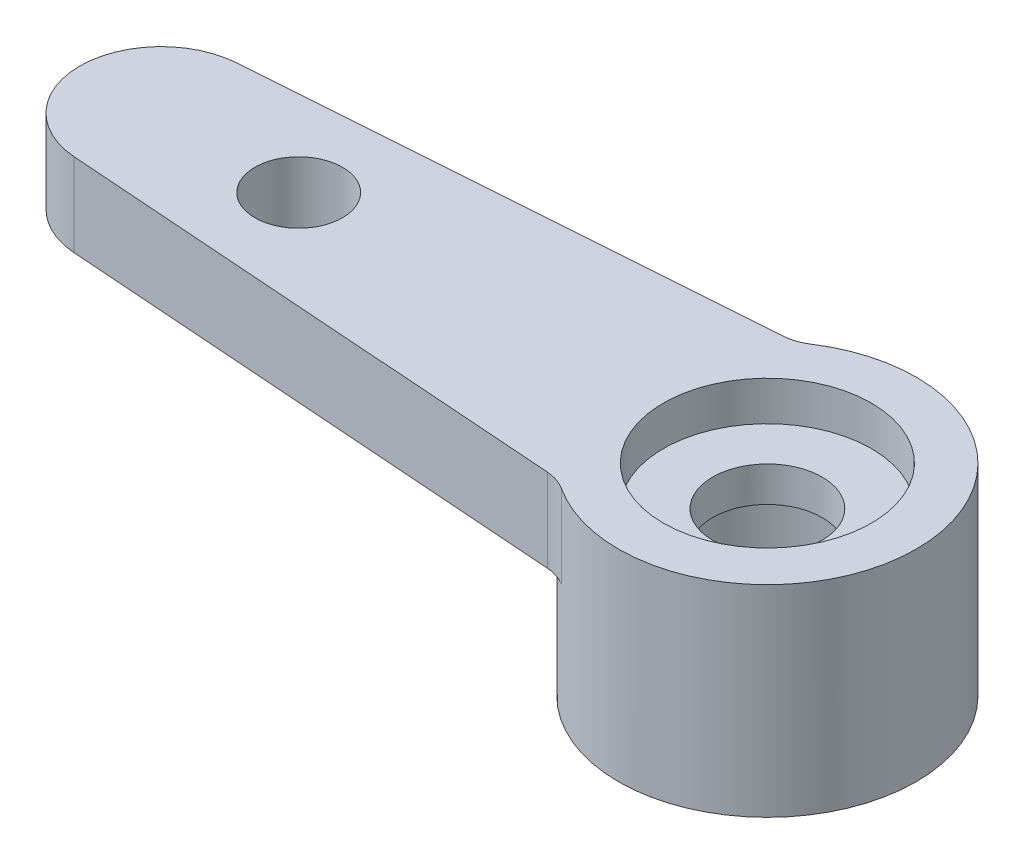
ISO-10303-21;
HEADER;
FILE_DESCRIPTION(('STEP AP214'),'2;1');
FILE_NAME('part.step','',(''),(''),'','','');
FILE_SCHEMA(('AUTOMOTIVE_DESIGN { 1 0 10303 214 1 1 1 1 }'));
ENDSEC;
DATA;
#1=APPLICATION_CONTEXT('core data for automotive mechanical design processes');
#2=APPLICATION_PROTOCOL_DEFINITION('international standard','automotive_design',2000,#1);
#3=PRODUCT_CONTEXT('',#1,'mechanical');
#4=PRODUCT('Part','Part','',(#3));
#5=PRODUCT_RELATED_PRODUCT_CATEGORY('part','',(#4));
#6=PRODUCT_DEFINITION_FORMATION('','',#4);
#7=PRODUCT_DEFINITION_CONTEXT('part definition',#1,'design');
#8=PRODUCT_DEFINITION('design','',#6,#7);
#9=PRODUCT_DEFINITION_SHAPE('','',#8);
#10=(LENGTH_UNIT() NAMED_UNIT(*) SI_UNIT(.MILLI.,.METRE.));
#11=(NAMED_UNIT(*) PLANE_ANGLE_UNIT() SI_UNIT($,.RADIAN.));
#12=(NAMED_UNIT(*) SI_UNIT($,.STERADIAN.) SOLID_ANGLE_UNIT());
#13=UNCERTAINTY_MEASURE_WITH_UNIT(LENGTH_MEASURE(1.E-05),#10,'distance_accuracy_value','');
#14=(GEOMETRIC_REPRESENTATION_CONTEXT(3) GLOBAL_UNCERTAINTY_ASSIGNED_CONTEXT((#13)) GLOBAL_UNIT_ASSIGNED_CONTEXT((#10,
#11,#12)) REPRESENTATION_CONTEXT('',''));
#15=CARTESIAN_POINT('',(0.,0.,0.));
#16=DIRECTION('',(0.,0.,1.));
#17=DIRECTION('',(1.,0.,0.));
#18=AXIS2_PLACEMENT_3D('',#15,#16,#17);
#19=CARTESIAN_POINT('',(0.,-0.00100000000000013,0.));
#20=DIRECTION('',(0.,1.,0.));
#21=DIRECTION('',(0.,0.,1.));
#22=AXIS2_PLACEMENT_3D('',#19,#20,#21);
#23=CYLINDRICAL_SURFACE('',#22,1.25);
#24=CARTESIAN_POINT('',(0.,2.9,0.));
#25=DIRECTION('',(0.,-1.,0.));
#26=DIRECTION('',(0.,0.,-1.));
#27=AXIS2_PLACEMENT_3D('',#24,#25,#26);
#28=CIRCLE('',#27,1.25);
#29=CARTESIAN_POINT('',(0.,2.9,-1.25));
#30=VERTEX_POINT('',#29);
#31=EDGE_CURVE('E203',#30,#30,#28,.F.);
#32=ORIENTED_EDGE('',*,*,#31,.F.);
#33=EDGE_LOOP('',(#32));
#34=FACE_BOUND('',#33,.T.);
#35=CARTESIAN_POINT('',(0.,3.7,0.));
#36=DIRECTION('',(0.,1.,0.));
#37=DIRECTION('',(0.,0.,1.));
#38=AXIS2_PLACEMENT_3D('',#35,#36,#37);
#39=CIRCLE('',#38,1.25);
#40=CARTESIAN_POINT('',(0.,3.7,1.25));
#41=VERTEX_POINT('',#40);
#42=EDGE_CURVE('E38',#41,#41,#39,.F.);
#43=ORIENTED_EDGE('',*,*,#42,.F.);
#44=EDGE_LOOP('',(#43));
#45=FACE_BOUND('',#44,.T.);
#46=ADVANCED_FACE('F34',(#34,#45),#23,.F.);
#47=CARTESIAN_POINT('',(0.,4.6,0.));
#48=DIRECTION('',(0.,-1.,0.));
#49=DIRECTION('',(0.,0.,-1.));
#50=AXIS2_PLACEMENT_3D('',#47,#48,#49);
#51=CYLINDRICAL_SURFACE('',#50,3.4);
#52=CARTESIAN_POINT('',(0.,2.7,0.));
#53=DIRECTION('',(0.,1.,0.));
#54=DIRECTION('',(0.,0.,1.));
#55=AXIS2_PLACEMENT_3D('',#52,#53,#54);
#56=CIRCLE('',#55,3.4);
#57=CARTESIAN_POINT('',(-1.85469778922049,2.7,-2.84957823381998));
#58=VERTEX_POINT('',#57);
#59=CARTESIAN_POINT('',(-1.85469778922049,2.7,2.84957823381999));
#60=VERTEX_POINT('',#59);
#61=EDGE_CURVE('E123',#58,#60,#56,.T.);
#62=ORIENTED_EDGE('',*,*,#61,.F.);
#63=DIRECTION('',(0.,-1.,0.));
#64=VECTOR('',#63,1.);
#65=CARTESIAN_POINT('',(-1.85469778922049,4.6,-2.84957823381999));
#66=LINE('',#65,#64);
#67=CARTESIAN_POINT('',(-1.85469778922049,4.6,-2.84957823381998));
#68=VERTEX_POINT('',#67);
#69=EDGE_CURVE('E130',#58,#68,#66,.F.);
#70=ORIENTED_EDGE('',*,*,#69,.T.);
#71=CARTESIAN_POINT('',(0.,4.6,0.));
#72=DIRECTION('',(0.,1.,0.));
#73=DIRECTION('',(0.,0.,1.));
#74=AXIS2_PLACEMENT_3D('',#71,#72,#73);
#75=CIRCLE('',#74,3.4);
#76=CARTESIAN_POINT('',(-1.85469778922049,4.6,2.84957823381999));
#77=VERTEX_POINT('',#76);
#78=EDGE_CURVE('E120',#77,#68,#75,.T.);
#79=ORIENTED_EDGE('',*,*,#78,.F.);
#80=DIRECTION('',(0.,-1.,0.));
#81=VECTOR('',#80,1.);
#82=CARTESIAN_POINT('',(-1.85469778922049,4.6,2.84957823381999));
#83=LINE('',#82,#81);
#84=EDGE_CURVE('E127',#77,#60,#83,.T.);
#85=ORIENTED_EDGE('',*,*,#84,.T.);
#86=EDGE_LOOP('',(#62,#70,#79,#85));
#87=FACE_BOUND('',#86,.T.);
#88=CARTESIAN_POINT('',(0.,0.,0.));
#89=DIRECTION('',(0.,1.,0.));
#90=DIRECTION('',(0.,0.,1.));
#91=AXIS2_PLACEMENT_3D('',#88,#89,#90);
#92=CIRCLE('',#91,3.4);
#93=CARTESIAN_POINT('',(0.,0.,3.4));
#94=VERTEX_POINT('',#93);
#95=EDGE_CURVE('E118',#94,#94,#92,.T.);
#96=ORIENTED_EDGE('',*,*,#95,.T.);
#97=EDGE_LOOP('',(#96));
#98=FACE_BOUND('',#97,.T.);
#99=ADVANCED_FACE('F146',(#87,#98),#51,.T.);
#100=CARTESIAN_POINT('',(0.,4.6,0.));
#101=DIRECTION('',(0.,1.,0.));
#102=DIRECTION('',(0.,0.,1.));
#103=AXIS2_PLACEMENT_3D('',#100,#101,#102);
#104=PLANE('',#103);
#105=CARTESIAN_POINT('',(-10.7,4.6,0.));
#106=DIRECTION('',(0.,1.,0.));
#107=DIRECTION('',(0.,0.,1.));
#108=AXIS2_PLACEMENT_3D('',#105,#106,#107);
#109=CIRCLE('',#108,1.);
#110=CARTESIAN_POINT('',(-10.7,4.6,1.));
#111=VERTEX_POINT('',#110);
#112=EDGE_CURVE('E218',#111,#111,#109,.T.);
#113=ORIENTED_EDGE('',*,*,#112,.F.);
#114=EDGE_LOOP('',(#113));
#115=FACE_BOUND('',#114,.T.);
#116=CARTESIAN_POINT('',(0.,4.6,0.));
#117=DIRECTION('',(0.,1.,0.));
#118=DIRECTION('',(0.,0.,1.));
#119=AXIS2_PLACEMENT_3D('',#116,#117,#118);
#120=CIRCLE('',#119,2.375);
#121=CARTESIAN_POINT('',(0.,4.6,2.375));
#122=VERTEX_POINT('',#121);
#123=EDGE_CURVE('E210',#122,#122,#120,.T.);
#124=ORIENTED_EDGE('',*,*,#123,.F.);
#125=EDGE_LOOP('',(#124));
#126=FACE_BOUND('',#125,.T.);
#127=DIRECTION('',(0.997438729547009,0.,0.0715260847498971));
#128=VECTOR('',#127,1.);
#129=CARTESIAN_POINT('',(-13.9730385176348,4.6,1.85523603695744));
#130=LINE('',#129,#128);
#131=CARTESIAN_POINT('',(-13.9730385176348,4.6,1.85523603695744));
#132=VERTEX_POINT('',#131);
#133=CARTESIAN_POINT('',(-2.32867105424132,4.6,2.69025074951415));
#134=VERTEX_POINT('',#133);
#135=EDGE_CURVE('E90',#132,#134,#130,.T.);
#136=ORIENTED_EDGE('',*,*,#135,.T.);
#137=CARTESIAN_POINT('',(-2.40019713899122,4.6,3.68768947906116));
#138=DIRECTION('',(0.,1.,0.));
#139=DIRECTION('',(0.,0.,1.));
#140=AXIS2_PLACEMENT_3D('',#137,#138,#139);
#141=CIRCLE('',#140,1.);
#142=EDGE_CURVE('E43',#134,#77,#141,.F.);
#143=ORIENTED_EDGE('',*,*,#142,.T.);
#144=ORIENTED_EDGE('',*,*,#78,.T.);
#145=CARTESIAN_POINT('',(-2.40019713899122,4.6,-3.68768947906116));
#146=DIRECTION('',(0.,1.,0.));
#147=DIRECTION('',(0.,0.,1.));
#148=AXIS2_PLACEMENT_3D('',#145,#146,#147);
#149=CIRCLE('',#148,1.);
#150=CARTESIAN_POINT('',(-2.32867105424132,4.6,-2.69025074951415));
#151=VERTEX_POINT('',#150);
#152=EDGE_CURVE('E137',#68,#151,#149,.F.);
#153=ORIENTED_EDGE('',*,*,#152,.T.);
#154=DIRECTION('',(-0.997438729547009,0.,0.0715260847498974));
#155=VECTOR('',#154,1.);
#156=CARTESIAN_POINT('',(-13.9730385176348,4.6,-1.85523603695743));
#157=LINE('',#156,#155);
#158=CARTESIAN_POINT('',(-13.9730385176348,4.6,-1.85523603695743));
#159=VERTEX_POINT('',#158);
#160=EDGE_CURVE('E106',#151,#159,#157,.T.);
#161=ORIENTED_EDGE('',*,*,#160,.T.);
#162=CARTESIAN_POINT('',(-13.84,4.6,0.));
#163=DIRECTION('',(0.,1.,0.));
#164=DIRECTION('',(0.,0.,1.));
#165=AXIS2_PLACEMENT_3D('',#162,#163,#164);
#166=CIRCLE('',#165,1.86);
#167=EDGE_CURVE('E114',#159,#132,#166,.T.);
#168=ORIENTED_EDGE('',*,*,#167,.T.);
#169=EDGE_LOOP('',(#136,#143,#144,#153,#161,#168));
#170=FACE_BOUND('',#169,.T.);
#171=ADVANCED_FACE('F144',(#115,#126,#170),#104,.T.);
#172=CARTESIAN_POINT('',(0.,0.,0.));
#173=DIRECTION('',(0.,1.,0.));
#174=DIRECTION('',(0.,0.,1.));
#175=AXIS2_PLACEMENT_3D('',#172,#173,#174);
#176=PLANE('',#175);
#177=CARTESIAN_POINT('',(0.,0.,0.));
#178=DIRECTION('',(0.,-1.,0.));
#179=DIRECTION('',(0.,0.,-1.));
#180=AXIS2_PLACEMENT_3D('',#177,#178,#179);
#181=CIRCLE('',#180,2.325);
#182=CARTESIAN_POINT('',(0.,0.,-2.325));
#183=VERTEX_POINT('',#182);
#184=EDGE_CURVE('E110',#183,#183,#181,.T.);
#185=ORIENTED_EDGE('',*,*,#184,.F.);
#186=EDGE_LOOP('',(#185));
#187=FACE_BOUND('',#186,.T.);
#188=ORIENTED_EDGE('',*,*,#95,.F.);
#189=EDGE_LOOP('',(#188));
#190=FACE_BOUND('',#189,.T.);
#191=ADVANCED_FACE('F181',(#187,#190),#176,.F.);
#192=CARTESIAN_POINT('',(-13.84,2.7,0.));
#193=DIRECTION('',(0.,1.,0.));
#194=DIRECTION('',(0.,0.,1.));
#195=AXIS2_PLACEMENT_3D('',#192,#193,#194);
#196=PLANE('',#195);
#197=CARTESIAN_POINT('',(-10.7,2.7,0.));
#198=DIRECTION('',(0.,1.,0.));
#199=DIRECTION('',(0.,0.,1.));
#200=AXIS2_PLACEMENT_3D('',#197,#198,#199);
#201=CIRCLE('',#200,1.);
#202=CARTESIAN_POINT('',(-10.7,2.7,1.));
#203=VERTEX_POINT('',#202);
#204=EDGE_CURVE('E213',#203,#203,#201,.F.);
#205=ORIENTED_EDGE('',*,*,#204,.F.);
#206=EDGE_LOOP('',(#205));
#207=FACE_BOUND('',#206,.T.);
#208=DIRECTION('',(-0.997438729547009,0.,0.0715260847498974));
#209=VECTOR('',#208,1.);
#210=CARTESIAN_POINT('',(-13.9730385176348,2.7,-1.85523603695743));
#211=LINE('',#210,#209);
#212=CARTESIAN_POINT('',(-2.32867105424132,2.7,-2.69025074951415));
#213=VERTEX_POINT('',#212);
#214=CARTESIAN_POINT('',(-13.9730385176348,2.7,-1.85523603695743));
#215=VERTEX_POINT('',#214);
#216=EDGE_CURVE('E96',#213,#215,#211,.T.);
#217=ORIENTED_EDGE('',*,*,#216,.F.);
#218=CARTESIAN_POINT('',(-2.40019713899122,2.7,-3.68768947906116));
#219=DIRECTION('',(0.,1.,0.));
#220=DIRECTION('',(0.,0.,1.));
#221=AXIS2_PLACEMENT_3D('',#218,#219,#220);
#222=CIRCLE('',#221,1.);
#223=EDGE_CURVE('E139',#213,#58,#222,.T.);
#224=ORIENTED_EDGE('',*,*,#223,.T.);
#225=ORIENTED_EDGE('',*,*,#61,.T.);
#226=CARTESIAN_POINT('',(-2.40019713899122,2.7,3.68768947906116));
#227=DIRECTION('',(0.,1.,0.));
#228=DIRECTION('',(0.,0.,1.));
#229=AXIS2_PLACEMENT_3D('',#226,#227,#228);
#230=CIRCLE('',#229,1.);
#231=CARTESIAN_POINT('',(-2.32867105424132,2.7,2.69025074951415));
#232=VERTEX_POINT('',#231);
#233=EDGE_CURVE('E11',#60,#232,#230,.T.);
#234=ORIENTED_EDGE('',*,*,#233,.T.);
#235=DIRECTION('',(0.997438729547009,0.,0.0715260847498971));
#236=VECTOR('',#235,1.);
#237=CARTESIAN_POINT('',(-13.9730385176348,2.7,1.85523603695744));
#238=LINE('',#237,#236);
#239=CARTESIAN_POINT('',(-13.9730385176348,2.7,1.85523603695744));
#240=VERTEX_POINT('',#239);
#241=EDGE_CURVE('E88',#240,#232,#238,.T.);
#242=ORIENTED_EDGE('',*,*,#241,.F.);
#243=CARTESIAN_POINT('',(-13.84,2.7,0.));
#244=DIRECTION('',(0.,1.,0.));
#245=DIRECTION('',(0.,0.,1.));
#246=AXIS2_PLACEMENT_3D('',#243,#244,#245);
#247=CIRCLE('',#246,1.86);
#248=EDGE_CURVE('E101',#215,#240,#247,.T.);
#249=ORIENTED_EDGE('',*,*,#248,.F.);
#250=EDGE_LOOP('',(#217,#224,#225,#234,#242,#249));
#251=FACE_BOUND('',#250,.T.);
#252=ADVANCED_FACE('F100',(#207,#251),#196,.F.);
#253=CARTESIAN_POINT('',(-13.84,2.7,0.));
#254=DIRECTION('',(0.,1.,0.));
#255=DIRECTION('',(0.,0.,1.));
#256=AXIS2_PLACEMENT_3D('',#253,#254,#255);
#257=CYLINDRICAL_SURFACE('',#256,1.86);
#258=ORIENTED_EDGE('',*,*,#167,.F.);
#259=DIRECTION('',(0.,1.,0.));
#260=VECTOR('',#259,1.);
#261=CARTESIAN_POINT('',(-13.9730385176348,2.7,-1.85523603695743));
#262=LINE('',#261,#260);
#263=EDGE_CURVE('E95',#215,#159,#262,.T.);
#264=ORIENTED_EDGE('',*,*,#263,.F.);
#265=ORIENTED_EDGE('',*,*,#248,.T.);
#266=DIRECTION('',(0.,1.,0.));
#267=VECTOR('',#266,1.);
#268=CARTESIAN_POINT('',(-13.9730385176348,2.7,1.85523603695744));
#269=LINE('',#268,#267);
#270=EDGE_CURVE('E86',#240,#132,#269,.T.);
#271=ORIENTED_EDGE('',*,*,#270,.T.);
#272=EDGE_LOOP('',(#258,#264,#265,#271));
#273=FACE_BOUND('',#272,.T.);
#274=ADVANCED_FACE('F104',(#273),#257,.T.);
#275=CARTESIAN_POINT('',(-13.9730385176348,2.7,-1.85523603695743));
#276=DIRECTION('',(-0.0715260847498974,0.,-0.997438729547009));
#277=DIRECTION('',(-0.997438729547009,0.,0.0715260847498974));
#278=AXIS2_PLACEMENT_3D('',#275,#276,#277);
#279=PLANE('',#278);
#280=ORIENTED_EDGE('',*,*,#160,.F.);
#281=DIRECTION('',(0.,-1.,0.));
#282=VECTOR('',#281,1.);
#283=CARTESIAN_POINT('',(-2.32867105424133,2.7,-2.69025074951415));
#284=LINE('',#283,#282);
#285=EDGE_CURVE('E133',#151,#213,#284,.T.);
#286=ORIENTED_EDGE('',*,*,#285,.T.);
#287=ORIENTED_EDGE('',*,*,#216,.T.);
#288=ORIENTED_EDGE('',*,*,#263,.T.);
#289=EDGE_LOOP('',(#280,#286,#287,#288));
#290=FACE_BOUND('',#289,.T.);
#291=ADVANCED_FACE('F183',(#290),#279,.T.);
#292=CARTESIAN_POINT('',(-13.9730385176348,2.7,1.85523603695744));
#293=DIRECTION('',(-0.0715260847498971,0.,0.997438729547009));
#294=DIRECTION('',(0.997438729547009,0.,0.0715260847498971));
#295=AXIS2_PLACEMENT_3D('',#292,#293,#294);
#296=PLANE('',#295);
#297=ORIENTED_EDGE('',*,*,#241,.T.);
#298=DIRECTION('',(0.,-1.,0.));
#299=VECTOR('',#298,1.);
#300=CARTESIAN_POINT('',(-2.32867105424132,2.7,2.69025074951415));
#301=LINE('',#300,#299);
#302=EDGE_CURVE('E135',#232,#134,#301,.F.);
#303=ORIENTED_EDGE('',*,*,#302,.T.);
#304=ORIENTED_EDGE('',*,*,#135,.F.);
#305=ORIENTED_EDGE('',*,*,#270,.F.);
#306=EDGE_LOOP('',(#297,#303,#304,#305));
#307=FACE_BOUND('',#306,.T.);
#308=ADVANCED_FACE('F87',(#307),#296,.T.);
#309=CARTESIAN_POINT('',(0.,2.9,0.));
#310=DIRECTION('',(0.,-1.,0.));
#311=DIRECTION('',(0.,0.,-1.));
#312=AXIS2_PLACEMENT_3D('',#309,#310,#311);
#313=CYLINDRICAL_SURFACE('',#312,2.325);
#314=CARTESIAN_POINT('',(0.,2.9,0.));
#315=DIRECTION('',(0.,-1.,0.));
#316=DIRECTION('',(0.,0.,-1.));
#317=AXIS2_PLACEMENT_3D('',#314,#315,#316);
#318=CIRCLE('',#317,2.325);
#319=CARTESIAN_POINT('',(0.,2.9,-2.325));
#320=VERTEX_POINT('',#319);
#321=EDGE_CURVE('E116',#320,#320,#318,.T.);
#322=ORIENTED_EDGE('',*,*,#321,.F.);
#323=EDGE_LOOP('',(#322));
#324=FACE_BOUND('',#323,.T.);
#325=ORIENTED_EDGE('',*,*,#184,.T.);
#326=EDGE_LOOP('',(#325));
#327=FACE_BOUND('',#326,.T.);
#328=ADVANCED_FACE('F174',(#324,#327),#313,.F.);
#329=CARTESIAN_POINT('',(0.,2.9,0.));
#330=DIRECTION('',(0.,-1.,0.));
#331=DIRECTION('',(0.,0.,-1.));
#332=AXIS2_PLACEMENT_3D('',#329,#330,#331);
#333=PLANE('',#332);
#334=ORIENTED_EDGE('',*,*,#31,.T.);
#335=EDGE_LOOP('',(#334));
#336=FACE_BOUND('',#335,.T.);
#337=ORIENTED_EDGE('',*,*,#321,.T.);
#338=EDGE_LOOP('',(#337));
#339=FACE_BOUND('',#338,.T.);
#340=ADVANCED_FACE('F159',(#336,#339),#333,.T.);
#341=CARTESIAN_POINT('',(-2.40019713899122,4.6,-3.68768947906116));
#342=DIRECTION('',(0.,-1.,0.));
#343=DIRECTION('',(0.,0.,-1.));
#344=AXIS2_PLACEMENT_3D('',#341,#342,#343);
#345=CYLINDRICAL_SURFACE('',#344,1.);
#346=ORIENTED_EDGE('',*,*,#223,.F.);
#347=ORIENTED_EDGE('',*,*,#285,.F.);
#348=ORIENTED_EDGE('',*,*,#152,.F.);
#349=ORIENTED_EDGE('',*,*,#69,.F.);
#350=EDGE_LOOP('',(#346,#347,#348,#349));
#351=FACE_BOUND('',#350,.T.);
#352=ADVANCED_FACE('F151',(#351),#345,.F.);
#353=CARTESIAN_POINT('',(-2.40019713899122,4.6,3.68768947906116));
#354=DIRECTION('',(0.,-1.,0.));
#355=DIRECTION('',(0.,0.,-1.));
#356=AXIS2_PLACEMENT_3D('',#353,#354,#355);
#357=CYLINDRICAL_SURFACE('',#356,1.);
#358=ORIENTED_EDGE('',*,*,#233,.F.);
#359=ORIENTED_EDGE('',*,*,#84,.F.);
#360=ORIENTED_EDGE('',*,*,#142,.F.);
#361=ORIENTED_EDGE('',*,*,#302,.F.);
#362=EDGE_LOOP('',(#358,#359,#360,#361));
#363=FACE_BOUND('',#362,.T.);
#364=ADVANCED_FACE('F36',(#363),#357,.F.);
#365=CARTESIAN_POINT('',(0.,3.7,0.));
#366=DIRECTION('',(0.,1.,0.));
#367=DIRECTION('',(0.,0.,1.));
#368=AXIS2_PLACEMENT_3D('',#365,#366,#367);
#369=PLANE('',#368);
#370=CARTESIAN_POINT('',(0.,3.7,0.));
#371=DIRECTION('',(0.,1.,0.));
#372=DIRECTION('',(0.,0.,1.));
#373=AXIS2_PLACEMENT_3D('',#370,#371,#372);
#374=CIRCLE('',#373,2.375);
#375=CARTESIAN_POINT('',(0.,3.7,2.375));
#376=VERTEX_POINT('',#375);
#377=EDGE_CURVE('E208',#376,#376,#374,.T.);
#378=ORIENTED_EDGE('',*,*,#377,.T.);
#379=EDGE_LOOP('',(#378));
#380=FACE_BOUND('',#379,.T.);
#381=ORIENTED_EDGE('',*,*,#42,.T.);
#382=EDGE_LOOP('',(#381));
#383=FACE_BOUND('',#382,.T.);
#384=ADVANCED_FACE('F150',(#380,#383),#369,.T.);
#385=CARTESIAN_POINT('',(0.,3.7,0.));
#386=DIRECTION('',(0.,1.,0.));
#387=DIRECTION('',(0.,0.,1.));
#388=AXIS2_PLACEMENT_3D('',#385,#386,#387);
#389=CYLINDRICAL_SURFACE('',#388,2.375);
#390=ORIENTED_EDGE('',*,*,#377,.F.);
#391=EDGE_LOOP('',(#390));
#392=FACE_BOUND('',#391,.T.);
#393=ORIENTED_EDGE('',*,*,#123,.T.);
#394=EDGE_LOOP('',(#393));
#395=FACE_BOUND('',#394,.T.);
#396=ADVANCED_FACE('F156',(#392,#395),#389,.F.);
#397=CARTESIAN_POINT('',(-10.7,-0.00100000000000013,0.));
#398=DIRECTION('',(0.,1.,0.));
#399=DIRECTION('',(0.,0.,1.));
#400=AXIS2_PLACEMENT_3D('',#397,#398,#399);
#401=CYLINDRICAL_SURFACE('',#400,1.);
#402=ORIENTED_EDGE('',*,*,#112,.T.);
#403=EDGE_LOOP('',(#402));
#404=FACE_BOUND('',#403,.T.);
#405=ORIENTED_EDGE('',*,*,#204,.T.);
#406=EDGE_LOOP('',(#405));
#407=FACE_BOUND('',#406,.T.);
#408=ADVANCED_FACE('F222',(#404,#407),#401,.F.);
#409=CLOSED_SHELL('',(#46,#99,#171,#191,#252,#274,#291,#308,#328,#340,#352,#364,#384,#396,#408));
#410=MANIFOLD_SOLID_BREP('B2',#409);
#411=ADVANCED_BREP_SHAPE_REPRESENTATION('',(#18,#410),#14);
#412=SHAPE_DEFINITION_REPRESENTATION(#9,#411);
ENDSEC;
END-ISO-10303-21;
